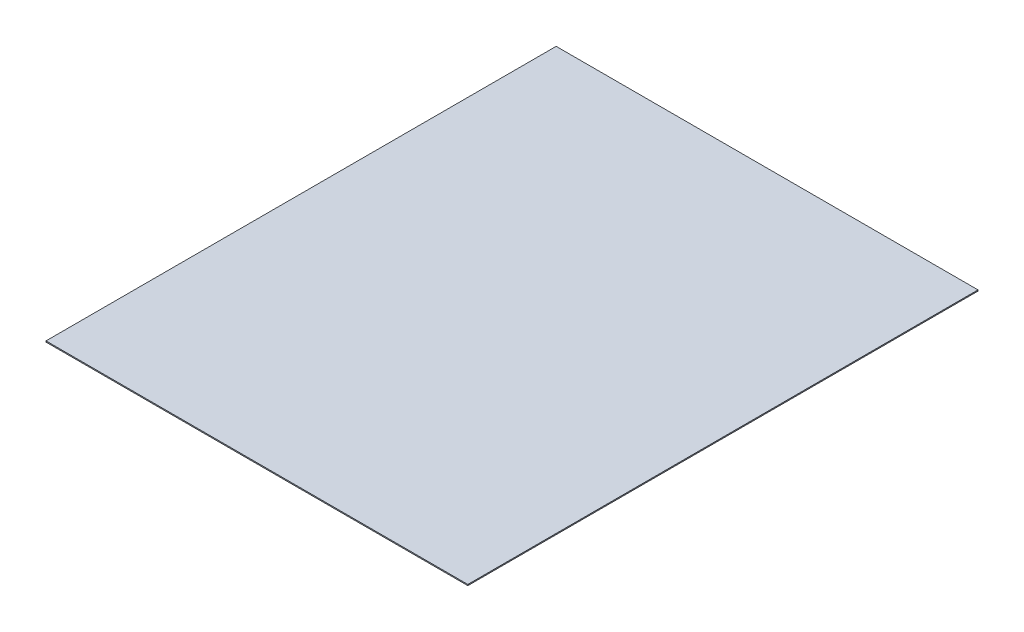
ISO-10303-21;
HEADER;
FILE_DESCRIPTION(('STEP AP214'),'2;1');
FILE_NAME('part.step','',(''),(''),'','','');
FILE_SCHEMA(('AUTOMOTIVE_DESIGN { 1 0 10303 214 1 1 1 1 }'));
ENDSEC;
DATA;
#1=APPLICATION_CONTEXT('core data for automotive mechanical design processes');
#2=APPLICATION_PROTOCOL_DEFINITION('international standard','automotive_design',2000,#1);
#3=PRODUCT_CONTEXT('',#1,'mechanical');
#4=PRODUCT('Part','Part','',(#3));
#5=PRODUCT_RELATED_PRODUCT_CATEGORY('part','',(#4));
#6=PRODUCT_DEFINITION_FORMATION('','',#4);
#7=PRODUCT_DEFINITION_CONTEXT('part definition',#1,'design');
#8=PRODUCT_DEFINITION('design','',#6,#7);
#9=PRODUCT_DEFINITION_SHAPE('','',#8);
#10=(LENGTH_UNIT() NAMED_UNIT(*) SI_UNIT(.MILLI.,.METRE.));
#11=(NAMED_UNIT(*) PLANE_ANGLE_UNIT() SI_UNIT($,.RADIAN.));
#12=(NAMED_UNIT(*) SI_UNIT($,.STERADIAN.) SOLID_ANGLE_UNIT());
#13=UNCERTAINTY_MEASURE_WITH_UNIT(LENGTH_MEASURE(1.E-05),#10,'distance_accuracy_value','');
#14=(GEOMETRIC_REPRESENTATION_CONTEXT(3) GLOBAL_UNCERTAINTY_ASSIGNED_CONTEXT((#13)) GLOBAL_UNIT_ASSIGNED_CONTEXT((#10,
#11,#12)) REPRESENTATION_CONTEXT('',''));
#15=CARTESIAN_POINT('',(0.,0.,0.));
#16=DIRECTION('',(0.,0.,1.));
#17=DIRECTION('',(1.,0.,0.));
#18=AXIS2_PLACEMENT_3D('',#15,#16,#17);
#19=CARTESIAN_POINT('',(16.7,5.,-710.));
#20=DIRECTION('',(-1.,0.,0.));
#21=DIRECTION('',(0.,0.,1.));
#22=AXIS2_PLACEMENT_3D('',#19,#20,#21);
#23=PLANE('',#22);
#24=DIRECTION('',(0.,-1.,0.));
#25=VECTOR('',#24,1.);
#26=CARTESIAN_POINT('',(16.7,5.,-3.));
#27=LINE('',#26,#25);
#28=CARTESIAN_POINT('',(16.7,6.5,-3.));
#29=VERTEX_POINT('',#28);
#30=CARTESIAN_POINT('',(16.7,5.,-3.));
#31=VERTEX_POINT('',#30);
#32=EDGE_CURVE('E103',#29,#31,#27,.T.);
#33=ORIENTED_EDGE('',*,*,#32,.F.);
#34=DIRECTION('',(0.,0.,1.));
#35=VECTOR('',#34,1.);
#36=CARTESIAN_POINT('',(16.7,6.5,-710.));
#37=LINE('',#36,#35);
#38=CARTESIAN_POINT('',(16.7,6.5,-710.));
#39=VERTEX_POINT('',#38);
#40=EDGE_CURVE('E11',#39,#29,#37,.T.);
#41=ORIENTED_EDGE('',*,*,#40,.F.);
#42=DIRECTION('',(0.,-1.,0.));
#43=VECTOR('',#42,1.);
#44=CARTESIAN_POINT('',(16.7,5.,-710.));
#45=LINE('',#44,#43);
#46=CARTESIAN_POINT('',(16.7,5.,-710.));
#47=VERTEX_POINT('',#46);
#48=EDGE_CURVE('E97',#39,#47,#45,.T.);
#49=ORIENTED_EDGE('',*,*,#48,.T.);
#50=DIRECTION('',(0.,0.,1.));
#51=VECTOR('',#50,1.);
#52=CARTESIAN_POINT('',(16.7,5.,-710.));
#53=LINE('',#52,#51);
#54=EDGE_CURVE('E42',#47,#31,#53,.T.);
#55=ORIENTED_EDGE('',*,*,#54,.T.);
#56=EDGE_LOOP('',(#33,#41,#49,#55));
#57=FACE_BOUND('',#56,.T.);
#58=ADVANCED_FACE('F39',(#57),#23,.T.);
#59=CARTESIAN_POINT('',(16.7,6.5,-710.));
#60=DIRECTION('',(0.,1.,0.));
#61=DIRECTION('',(0.,0.,1.));
#62=AXIS2_PLACEMENT_3D('',#59,#60,#61);
#63=PLANE('',#62);
#64=DIRECTION('',(-1.,0.,0.));
#65=VECTOR('',#64,1.);
#66=CARTESIAN_POINT('',(16.7,6.5,-3.));
#67=LINE('',#66,#65);
#68=CARTESIAN_POINT('',(601.3,6.5,-3.));
#69=VERTEX_POINT('',#68);
#70=EDGE_CURVE('E99',#69,#29,#67,.T.);
#71=ORIENTED_EDGE('',*,*,#70,.F.);
#72=DIRECTION('',(0.,0.,1.));
#73=VECTOR('',#72,1.);
#74=CARTESIAN_POINT('',(601.3,6.5,-710.));
#75=LINE('',#74,#73);
#76=CARTESIAN_POINT('',(601.3,6.5,-710.));
#77=VERTEX_POINT('',#76);
#78=EDGE_CURVE('E48',#77,#69,#75,.T.);
#79=ORIENTED_EDGE('',*,*,#78,.F.);
#80=DIRECTION('',(-1.,0.,0.));
#81=VECTOR('',#80,1.);
#82=CARTESIAN_POINT('',(16.7,6.5,-710.));
#83=LINE('',#82,#81);
#84=EDGE_CURVE('E94',#77,#39,#83,.T.);
#85=ORIENTED_EDGE('',*,*,#84,.T.);
#86=ORIENTED_EDGE('',*,*,#40,.T.);
#87=EDGE_LOOP('',(#71,#79,#85,#86));
#88=FACE_BOUND('',#87,.T.);
#89=ADVANCED_FACE('F113',(#88),#63,.T.);
#90=CARTESIAN_POINT('',(601.3,5.,-710.));
#91=DIRECTION('',(1.,0.,0.));
#92=DIRECTION('',(0.,0.,-1.));
#93=AXIS2_PLACEMENT_3D('',#90,#91,#92);
#94=PLANE('',#93);
#95=DIRECTION('',(0.,1.,0.));
#96=VECTOR('',#95,1.);
#97=CARTESIAN_POINT('',(601.3,5.,-3.));
#98=LINE('',#97,#96);
#99=CARTESIAN_POINT('',(601.3,5.,-3.));
#100=VERTEX_POINT('',#99);
#101=EDGE_CURVE('E89',#100,#69,#98,.T.);
#102=ORIENTED_EDGE('',*,*,#101,.F.);
#103=DIRECTION('',(0.,0.,1.));
#104=VECTOR('',#103,1.);
#105=CARTESIAN_POINT('',(601.3,5.,-710.));
#106=LINE('',#105,#104);
#107=CARTESIAN_POINT('',(601.3,5.,-710.));
#108=VERTEX_POINT('',#107);
#109=EDGE_CURVE('E84',#108,#100,#106,.T.);
#110=ORIENTED_EDGE('',*,*,#109,.F.);
#111=DIRECTION('',(0.,1.,0.));
#112=VECTOR('',#111,1.);
#113=CARTESIAN_POINT('',(601.3,5.,-710.));
#114=LINE('',#113,#112);
#115=EDGE_CURVE('E87',#108,#77,#114,.T.);
#116=ORIENTED_EDGE('',*,*,#115,.T.);
#117=ORIENTED_EDGE('',*,*,#78,.T.);
#118=EDGE_LOOP('',(#102,#110,#116,#117));
#119=FACE_BOUND('',#118,.T.);
#120=ADVANCED_FACE('F86',(#119),#94,.T.);
#121=CARTESIAN_POINT('',(16.7,5.,-710.));
#122=DIRECTION('',(0.,-1.,0.));
#123=DIRECTION('',(0.,0.,-1.));
#124=AXIS2_PLACEMENT_3D('',#121,#122,#123);
#125=PLANE('',#124);
#126=DIRECTION('',(1.,0.,0.));
#127=VECTOR('',#126,1.);
#128=CARTESIAN_POINT('',(16.7,5.,-3.));
#129=LINE('',#128,#127);
#130=EDGE_CURVE('E106',#31,#100,#129,.T.);
#131=ORIENTED_EDGE('',*,*,#130,.F.);
#132=ORIENTED_EDGE('',*,*,#54,.F.);
#133=DIRECTION('',(1.,0.,0.));
#134=VECTOR('',#133,1.);
#135=CARTESIAN_POINT('',(16.7,5.,-710.));
#136=LINE('',#135,#134);
#137=EDGE_CURVE('E93',#47,#108,#136,.T.);
#138=ORIENTED_EDGE('',*,*,#137,.T.);
#139=ORIENTED_EDGE('',*,*,#109,.T.);
#140=EDGE_LOOP('',(#131,#132,#138,#139));
#141=FACE_BOUND('',#140,.T.);
#142=ADVANCED_FACE('F96',(#141),#125,.T.);
#143=CARTESIAN_POINT('',(0.,0.,-710.));
#144=DIRECTION('',(0.,0.,-1.));
#145=DIRECTION('',(-1.,0.,0.));
#146=AXIS2_PLACEMENT_3D('',#143,#144,#145);
#147=PLANE('',#146);
#148=ORIENTED_EDGE('',*,*,#48,.F.);
#149=ORIENTED_EDGE('',*,*,#84,.F.);
#150=ORIENTED_EDGE('',*,*,#115,.F.);
#151=ORIENTED_EDGE('',*,*,#137,.F.);
#152=EDGE_LOOP('',(#148,#149,#150,#151));
#153=FACE_BOUND('',#152,.T.);
#154=ADVANCED_FACE('F92',(#153),#147,.T.);
#155=CARTESIAN_POINT('',(0.,0.,-3.));
#156=DIRECTION('',(0.,0.,-1.));
#157=DIRECTION('',(-1.,0.,0.));
#158=AXIS2_PLACEMENT_3D('',#155,#156,#157);
#159=PLANE('',#158);
#160=ORIENTED_EDGE('',*,*,#32,.T.);
#161=ORIENTED_EDGE('',*,*,#130,.T.);
#162=ORIENTED_EDGE('',*,*,#101,.T.);
#163=ORIENTED_EDGE('',*,*,#70,.T.);
#164=EDGE_LOOP('',(#160,#161,#162,#163));
#165=FACE_BOUND('',#164,.T.);
#166=ADVANCED_FACE('F112',(#165),#159,.F.);
#167=CLOSED_SHELL('',(#58,#89,#120,#142,#154,#166));
#168=MANIFOLD_SOLID_BREP('B2',#167);
#169=ADVANCED_BREP_SHAPE_REPRESENTATION('',(#18,#168),#14);
#170=SHAPE_DEFINITION_REPRESENTATION(#9,#169);
ENDSEC;
END-ISO-10303-21;
